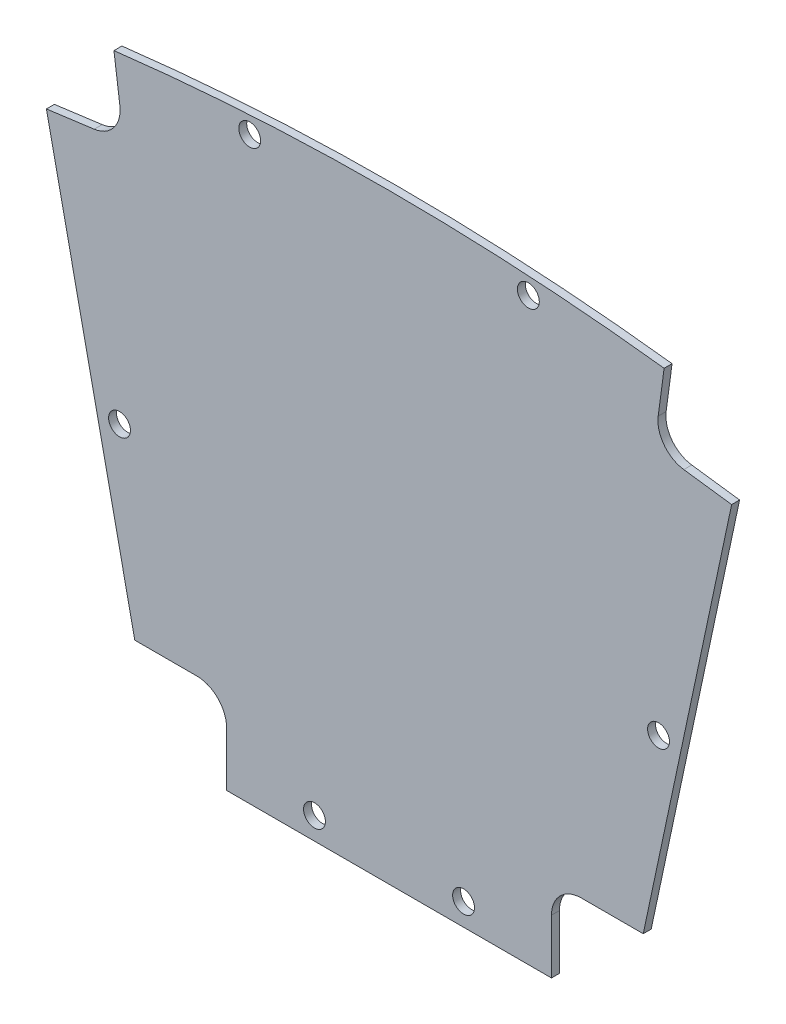
ISO-10303-21;
HEADER;
FILE_DESCRIPTION(('STEP AP214'),'2;1');
FILE_NAME('part.step','',(''),(''),'','','');
FILE_SCHEMA(('AUTOMOTIVE_DESIGN { 1 0 10303 214 1 1 1 1 }'));
ENDSEC;
DATA;
#1=APPLICATION_CONTEXT('core data for automotive mechanical design processes');
#2=APPLICATION_PROTOCOL_DEFINITION('international standard','automotive_design',2000,#1);
#3=PRODUCT_CONTEXT('',#1,'mechanical');
#4=PRODUCT('Part','Part','',(#3));
#5=PRODUCT_RELATED_PRODUCT_CATEGORY('part','',(#4));
#6=PRODUCT_DEFINITION_FORMATION('','',#4);
#7=PRODUCT_DEFINITION_CONTEXT('part definition',#1,'design');
#8=PRODUCT_DEFINITION('design','',#6,#7);
#9=PRODUCT_DEFINITION_SHAPE('','',#8);
#10=(LENGTH_UNIT() NAMED_UNIT(*) SI_UNIT(.MILLI.,.METRE.));
#11=(NAMED_UNIT(*) PLANE_ANGLE_UNIT() SI_UNIT($,.RADIAN.));
#12=(NAMED_UNIT(*) SI_UNIT($,.STERADIAN.) SOLID_ANGLE_UNIT());
#13=UNCERTAINTY_MEASURE_WITH_UNIT(LENGTH_MEASURE(1.E-05),#10,'distance_accuracy_value','');
#14=(GEOMETRIC_REPRESENTATION_CONTEXT(3) GLOBAL_UNCERTAINTY_ASSIGNED_CONTEXT((#13)) GLOBAL_UNIT_ASSIGNED_CONTEXT((#10,
#11,#12)) REPRESENTATION_CONTEXT('',''));
#15=CARTESIAN_POINT('',(0.,0.,0.));
#16=DIRECTION('',(0.,0.,1.));
#17=DIRECTION('',(1.,0.,0.));
#18=AXIS2_PLACEMENT_3D('',#15,#16,#17);
#19=CARTESIAN_POINT('',(0.,-402.867496497193,1.6));
#20=DIRECTION('',(0.,0.,1.));
#21=DIRECTION('',(1.,0.,0.));
#22=AXIS2_PLACEMENT_3D('',#19,#20,#21);
#23=PLANE('',#22);
#24=CARTESIAN_POINT('',(54.2394424791723,-6.73042928919355,1.6));
#25=DIRECTION('',(0.,0.,1.));
#26=DIRECTION('',(-1.,0.,0.));
#27=AXIS2_PLACEMENT_3D('',#24,#25,#26);
#28=CIRCLE('',#27,2.20000000000001);
#29=CARTESIAN_POINT('',(52.0394424791723,-6.73042928919355,1.6));
#30=VERTEX_POINT('',#29);
#31=EDGE_CURVE('E328',#30,#30,#28,.T.);
#32=ORIENTED_EDGE('',*,*,#31,.F.);
#33=EDGE_LOOP('',(#32));
#34=FACE_BOUND('',#33,.T.);
#35=CARTESIAN_POINT('',(-15.,-55.2941066679907,1.6));
#36=DIRECTION('',(0.,0.,1.));
#37=DIRECTION('',(1.,0.,0.));
#38=AXIS2_PLACEMENT_3D('',#35,#36,#37);
#39=CIRCLE('',#38,2.2);
#40=CARTESIAN_POINT('',(-12.8,-55.2941066679907,1.6));
#41=VERTEX_POINT('',#40);
#42=EDGE_CURVE('E316',#41,#41,#39,.T.);
#43=ORIENTED_EDGE('',*,*,#42,.F.);
#44=EDGE_LOOP('',(#43));
#45=FACE_BOUND('',#44,.T.);
#46=CARTESIAN_POINT('',(-28.0398435867955,56.8532825264212,1.6));
#47=DIRECTION('',(0.,0.,1.));
#48=DIRECTION('',(1.,0.,0.));
#49=AXIS2_PLACEMENT_3D('',#46,#47,#48);
#50=CIRCLE('',#49,2.2);
#51=CARTESIAN_POINT('',(-25.8398435867955,56.8532825264212,1.6));
#52=VERTEX_POINT('',#51);
#53=EDGE_CURVE('E189',#52,#52,#50,.T.);
#54=ORIENTED_EDGE('',*,*,#53,.F.);
#55=EDGE_LOOP('',(#54));
#56=FACE_BOUND('',#55,.T.);
#57=CARTESIAN_POINT('',(0.,-402.867496497193,1.6));
#58=DIRECTION('',(0.,0.,1.));
#59=DIRECTION('',(1.,0.,0.));
#60=AXIS2_PLACEMENT_3D('',#57,#58,#59);
#61=CIRCLE('',#60,464.);
#62=CARTESIAN_POINT('',(55.3628314309677,57.817815723575,1.6));
#63=VERTEX_POINT('',#62);
#64=CARTESIAN_POINT('',(-55.3628314309677,57.817815723575,1.6));
#65=VERTEX_POINT('',#64);
#66=EDGE_CURVE('E54',#63,#65,#61,.T.);
#67=ORIENTED_EDGE('',*,*,#66,.T.);
#68=DIRECTION('',(0.131884040495391,-0.991265151138993,0.));
#69=VECTOR('',#68,1.);
#70=CARTESIAN_POINT('',(-55.3628314309677,57.817815723575,1.6));
#71=LINE('',#70,#69);
#72=CARTESIAN_POINT('',(-54.1728843073821,48.8739502575355,1.6));
#73=VERTEX_POINT('',#72);
#74=EDGE_CURVE('E122',#65,#73,#71,.T.);
#75=ORIENTED_EDGE('',*,*,#74,.T.);
#76=CARTESIAN_POINT('',(-60.1204752142167,48.0826460145631,1.6));
#77=DIRECTION('',(0.,0.,-1.));
#78=DIRECTION('',(-1.,0.,0.));
#79=AXIS2_PLACEMENT_3D('',#76,#77,#78);
#80=CIRCLE('',#79,6.00000000000062);
#81=CARTESIAN_POINT('',(-59.3291709712428,42.1350551077287,1.6));
#82=VERTEX_POINT('',#81);
#83=EDGE_CURVE('E257',#73,#82,#80,.T.);
#84=ORIENTED_EDGE('',*,*,#83,.T.);
#85=DIRECTION('',(-0.991265151138961,-0.131884040495627,0.));
#86=VECTOR('',#85,1.);
#87=CARTESIAN_POINT('',(-59.3291709712428,42.1350551077287,1.6));
#88=LINE('',#87,#86);
#89=CARTESIAN_POINT('',(-68.9544530821245,40.8544481034022,1.6));
#90=VERTEX_POINT('',#89);
#91=EDGE_CURVE('E276',#82,#90,#88,.T.);
#92=ORIENTED_EDGE('',*,*,#91,.T.);
#93=DIRECTION('',(0.207911690817756,-0.978147600733806,0.));
#94=VECTOR('',#93,1.);
#95=CARTESIAN_POINT('',(-67.0274539414674,31.7886299253279,1.6));
#96=LINE('',#95,#94);
#97=CARTESIAN_POINT('',(-51.1634681219613,-42.845555417461,1.6));
#98=VERTEX_POINT('',#97);
#99=EDGE_CURVE('E273',#90,#98,#96,.T.);
#100=ORIENTED_EDGE('',*,*,#99,.T.);
#101=DIRECTION('',(1.,0.,0.));
#102=VECTOR('',#101,1.);
#103=CARTESIAN_POINT('',(-38.6949803535644,-42.845555417461,1.6));
#104=LINE('',#103,#102);
#105=CARTESIAN_POINT('',(-38.6949803535644,-42.845555417461,1.6));
#106=VERTEX_POINT('',#105);
#107=EDGE_CURVE('E275',#98,#106,#104,.T.);
#108=ORIENTED_EDGE('',*,*,#107,.T.);
#109=CARTESIAN_POINT('',(-38.6949803535644,-48.845555417461,1.6));
#110=DIRECTION('',(0.,0.,-1.));
#111=DIRECTION('',(1.,0.,0.));
#112=AXIS2_PLACEMENT_3D('',#109,#110,#111);
#113=CIRCLE('',#112,6.);
#114=CARTESIAN_POINT('',(-32.6949803535644,-48.845555417461,1.6));
#115=VERTEX_POINT('',#114);
#116=EDGE_CURVE('E278',#106,#115,#113,.T.);
#117=ORIENTED_EDGE('',*,*,#116,.T.);
#118=DIRECTION('',(0.,-1.,0.));
#119=VECTOR('',#118,1.);
#120=CARTESIAN_POINT('',(-32.6949803535644,-59.7941066679907,1.6));
#121=LINE('',#120,#119);
#122=CARTESIAN_POINT('',(-32.6949803535644,-59.7941066679907,1.6));
#123=VERTEX_POINT('',#122);
#124=EDGE_CURVE('E284',#115,#123,#121,.T.);
#125=ORIENTED_EDGE('',*,*,#124,.T.);
#126=DIRECTION('',(1.,0.,0.));
#127=VECTOR('',#126,1.);
#128=CARTESIAN_POINT('',(-20.,-59.7941066679907,1.6));
#129=LINE('',#128,#127);
#130=CARTESIAN_POINT('',(32.6949803535644,-59.7941066679907,1.6));
#131=VERTEX_POINT('',#130);
#132=EDGE_CURVE('E286',#123,#131,#129,.T.);
#133=ORIENTED_EDGE('',*,*,#132,.T.);
#134=DIRECTION('',(0.,1.,0.));
#135=VECTOR('',#134,1.);
#136=CARTESIAN_POINT('',(32.6949803535644,-59.7941066679907,1.6));
#137=LINE('',#136,#135);
#138=CARTESIAN_POINT('',(32.6949803535644,-48.845555417461,1.6));
#139=VERTEX_POINT('',#138);
#140=EDGE_CURVE('E288',#131,#139,#137,.T.);
#141=ORIENTED_EDGE('',*,*,#140,.T.);
#142=CARTESIAN_POINT('',(38.6949803535644,-48.845555417461,1.6));
#143=DIRECTION('',(0.,0.,-1.));
#144=DIRECTION('',(-1.,0.,0.));
#145=AXIS2_PLACEMENT_3D('',#142,#143,#144);
#146=CIRCLE('',#145,5.99999999999999);
#147=CARTESIAN_POINT('',(38.6949803535644,-42.845555417461,1.6));
#148=VERTEX_POINT('',#147);
#149=EDGE_CURVE('E290',#139,#148,#146,.T.);
#150=ORIENTED_EDGE('',*,*,#149,.T.);
#151=DIRECTION('',(1.,0.,0.));
#152=VECTOR('',#151,1.);
#153=CARTESIAN_POINT('',(38.6949803535644,-42.845555417461,1.6));
#154=LINE('',#153,#152);
#155=CARTESIAN_POINT('',(51.1634681219613,-42.845555417461,1.6));
#156=VERTEX_POINT('',#155);
#157=EDGE_CURVE('E292',#148,#156,#154,.T.);
#158=ORIENTED_EDGE('',*,*,#157,.T.);
#159=DIRECTION('',(0.207911690817756,0.978147600733806,0.));
#160=VECTOR('',#159,1.);
#161=CARTESIAN_POINT('',(51.1634681219613,-42.845555417461,1.6));
#162=LINE('',#161,#160);
#163=CARTESIAN_POINT('',(68.9544530821245,40.8544481034021,1.6));
#164=VERTEX_POINT('',#163);
#165=EDGE_CURVE('E166',#156,#164,#162,.T.);
#166=ORIENTED_EDGE('',*,*,#165,.T.);
#167=DIRECTION('',(-0.991265151138961,0.131884040495627,0.));
#168=VECTOR('',#167,1.);
#169=CARTESIAN_POINT('',(59.3291709712428,42.1350551077287,1.6));
#170=LINE('',#169,#168);
#171=CARTESIAN_POINT('',(59.3291709712428,42.1350551077287,1.6));
#172=VERTEX_POINT('',#171);
#173=EDGE_CURVE('E160',#164,#172,#170,.T.);
#174=ORIENTED_EDGE('',*,*,#173,.T.);
#175=CARTESIAN_POINT('',(60.1204752142167,48.082646014563,1.6));
#176=DIRECTION('',(0.,0.,-1.));
#177=DIRECTION('',(1.,0.,0.));
#178=AXIS2_PLACEMENT_3D('',#175,#176,#177);
#179=CIRCLE('',#178,6.00000000000062);
#180=CARTESIAN_POINT('',(54.1728843073821,48.8739502575355,1.6));
#181=VERTEX_POINT('',#180);
#182=EDGE_CURVE('E164',#172,#181,#179,.T.);
#183=ORIENTED_EDGE('',*,*,#182,.T.);
#184=DIRECTION('',(0.131884040495392,0.991265151138993,0.));
#185=VECTOR('',#184,1.);
#186=CARTESIAN_POINT('',(55.3628314309677,57.817815723575,1.6));
#187=LINE('',#186,#185);
#188=EDGE_CURVE('E180',#181,#63,#187,.T.);
#189=ORIENTED_EDGE('',*,*,#188,.T.);
#190=EDGE_LOOP('',(#67,#75,#84,#92,#100,#108,#117,#125,#133,#141,#150,#158,#166,#174,#183,#189));
#191=FACE_BOUND('',#190,.T.);
#192=CARTESIAN_POINT('',(-54.2394424791723,-6.73042928919355,1.6));
#193=DIRECTION('',(0.,0.,1.));
#194=DIRECTION('',(1.,0.,0.));
#195=AXIS2_PLACEMENT_3D('',#192,#193,#194);
#196=CIRCLE('',#195,2.20000000000001);
#197=CARTESIAN_POINT('',(-52.0394424791723,-6.73042928919355,1.6));
#198=VERTEX_POINT('',#197);
#199=EDGE_CURVE('E310',#198,#198,#196,.T.);
#200=ORIENTED_EDGE('',*,*,#199,.F.);
#201=EDGE_LOOP('',(#200));
#202=FACE_BOUND('',#201,.T.);
#203=CARTESIAN_POINT('',(15.,-55.2941066679907,1.6));
#204=DIRECTION('',(0.,0.,1.));
#205=DIRECTION('',(-1.,0.,0.));
#206=AXIS2_PLACEMENT_3D('',#203,#204,#205);
#207=CIRCLE('',#206,2.2);
#208=CARTESIAN_POINT('',(12.8,-55.2941066679907,1.6));
#209=VERTEX_POINT('',#208);
#210=EDGE_CURVE('E322',#209,#209,#207,.T.);
#211=ORIENTED_EDGE('',*,*,#210,.F.);
#212=EDGE_LOOP('',(#211));
#213=FACE_BOUND('',#212,.T.);
#214=CARTESIAN_POINT('',(28.0398435867955,56.8532825264212,1.6));
#215=DIRECTION('',(0.,0.,1.));
#216=DIRECTION('',(-1.,0.,0.));
#217=AXIS2_PLACEMENT_3D('',#214,#215,#216);
#218=CIRCLE('',#217,2.2);
#219=CARTESIAN_POINT('',(25.8398435867955,56.8532825264212,1.6));
#220=VERTEX_POINT('',#219);
#221=EDGE_CURVE('E334',#220,#220,#218,.T.);
#222=ORIENTED_EDGE('',*,*,#221,.F.);
#223=EDGE_LOOP('',(#222));
#224=FACE_BOUND('',#223,.T.);
#225=ADVANCED_FACE('F37',(#34,#45,#56,#191,#202,#213,#224),#23,.T.);
#226=CARTESIAN_POINT('',(0.,-402.867496497193,0.));
#227=DIRECTION('',(0.,0.,1.));
#228=DIRECTION('',(1.,0.,0.));
#229=AXIS2_PLACEMENT_3D('',#226,#227,#228);
#230=PLANE('',#229);
#231=DIRECTION('',(0.131884040495391,-0.991265151138993,0.));
#232=VECTOR('',#231,1.);
#233=CARTESIAN_POINT('',(-55.3628314309677,57.817815723575,0.));
#234=LINE('',#233,#232);
#235=CARTESIAN_POINT('',(-55.3628314309677,57.817815723575,0.));
#236=VERTEX_POINT('',#235);
#237=CARTESIAN_POINT('',(-54.1728843073821,48.8739502575355,0.));
#238=VERTEX_POINT('',#237);
#239=EDGE_CURVE('E186',#236,#238,#234,.T.);
#240=ORIENTED_EDGE('',*,*,#239,.F.);
#241=CARTESIAN_POINT('',(0.,-402.867496497193,0.));
#242=DIRECTION('',(0.,0.,1.));
#243=DIRECTION('',(-1.,0.,0.));
#244=AXIS2_PLACEMENT_3D('',#241,#242,#243);
#245=CIRCLE('',#244,464.);
#246=CARTESIAN_POINT('',(55.3628314309677,57.817815723575,0.));
#247=VERTEX_POINT('',#246);
#248=EDGE_CURVE('E217',#247,#236,#245,.T.);
#249=ORIENTED_EDGE('',*,*,#248,.F.);
#250=DIRECTION('',(0.131884040495392,0.991265151138993,0.));
#251=VECTOR('',#250,1.);
#252=CARTESIAN_POINT('',(55.3628314309677,57.817815723575,0.));
#253=LINE('',#252,#251);
#254=CARTESIAN_POINT('',(54.1728843073821,48.8739502575355,0.));
#255=VERTEX_POINT('',#254);
#256=EDGE_CURVE('E115',#255,#247,#253,.T.);
#257=ORIENTED_EDGE('',*,*,#256,.F.);
#258=CARTESIAN_POINT('',(60.1204752142167,48.082646014563,0.));
#259=DIRECTION('',(0.,0.,-1.));
#260=DIRECTION('',(1.,0.,0.));
#261=AXIS2_PLACEMENT_3D('',#258,#259,#260);
#262=CIRCLE('',#261,6.00000000000062);
#263=CARTESIAN_POINT('',(59.3291709712428,42.1350551077287,0.));
#264=VERTEX_POINT('',#263);
#265=EDGE_CURVE('E108',#264,#255,#262,.T.);
#266=ORIENTED_EDGE('',*,*,#265,.F.);
#267=DIRECTION('',(-0.991265151138961,0.131884040495627,0.));
#268=VECTOR('',#267,1.);
#269=CARTESIAN_POINT('',(59.3291709712428,42.1350551077287,0.));
#270=LINE('',#269,#268);
#271=CARTESIAN_POINT('',(68.9544530821245,40.8544481034021,0.));
#272=VERTEX_POINT('',#271);
#273=EDGE_CURVE('E174',#272,#264,#270,.T.);
#274=ORIENTED_EDGE('',*,*,#273,.F.);
#275=DIRECTION('',(0.207911690817756,0.978147600733806,0.));
#276=VECTOR('',#275,1.);
#277=CARTESIAN_POINT('',(67.0274539414674,31.7886299253279,0.));
#278=LINE('',#277,#276);
#279=CARTESIAN_POINT('',(51.1634681219613,-42.845555417461,0.));
#280=VERTEX_POINT('',#279);
#281=EDGE_CURVE('E212',#280,#272,#278,.T.);
#282=ORIENTED_EDGE('',*,*,#281,.F.);
#283=DIRECTION('',(1.,0.,0.));
#284=VECTOR('',#283,1.);
#285=CARTESIAN_POINT('',(38.6949803535644,-42.845555417461,0.));
#286=LINE('',#285,#284);
#287=CARTESIAN_POINT('',(38.6949803535644,-42.845555417461,0.));
#288=VERTEX_POINT('',#287);
#289=EDGE_CURVE('E209',#288,#280,#286,.T.);
#290=ORIENTED_EDGE('',*,*,#289,.F.);
#291=CARTESIAN_POINT('',(38.6949803535644,-48.845555417461,0.));
#292=DIRECTION('',(0.,0.,-1.));
#293=DIRECTION('',(-1.,0.,0.));
#294=AXIS2_PLACEMENT_3D('',#291,#292,#293);
#295=CIRCLE('',#294,5.99999999999999);
#296=CARTESIAN_POINT('',(32.6949803535644,-48.845555417461,0.));
#297=VERTEX_POINT('',#296);
#298=EDGE_CURVE('E207',#297,#288,#295,.T.);
#299=ORIENTED_EDGE('',*,*,#298,.F.);
#300=DIRECTION('',(0.,1.,0.));
#301=VECTOR('',#300,1.);
#302=CARTESIAN_POINT('',(32.6949803535644,-59.7941066679907,0.));
#303=LINE('',#302,#301);
#304=CARTESIAN_POINT('',(32.6949803535644,-59.7941066679907,0.));
#305=VERTEX_POINT('',#304);
#306=EDGE_CURVE('E205',#305,#297,#303,.T.);
#307=ORIENTED_EDGE('',*,*,#306,.F.);
#308=DIRECTION('',(1.,0.,0.));
#309=VECTOR('',#308,1.);
#310=CARTESIAN_POINT('',(20.,-59.7941066679907,0.));
#311=LINE('',#310,#309);
#312=CARTESIAN_POINT('',(-32.6949803535644,-59.7941066679907,0.));
#313=VERTEX_POINT('',#312);
#314=EDGE_CURVE('E203',#313,#305,#311,.T.);
#315=ORIENTED_EDGE('',*,*,#314,.F.);
#316=DIRECTION('',(0.,-1.,0.));
#317=VECTOR('',#316,1.);
#318=CARTESIAN_POINT('',(-32.6949803535644,-59.7941066679907,0.));
#319=LINE('',#318,#317);
#320=CARTESIAN_POINT('',(-32.6949803535644,-48.845555417461,0.));
#321=VERTEX_POINT('',#320);
#322=EDGE_CURVE('E200',#321,#313,#319,.T.);
#323=ORIENTED_EDGE('',*,*,#322,.F.);
#324=CARTESIAN_POINT('',(-38.6949803535644,-48.845555417461,0.));
#325=DIRECTION('',(0.,0.,-1.));
#326=DIRECTION('',(1.,0.,0.));
#327=AXIS2_PLACEMENT_3D('',#324,#325,#326);
#328=CIRCLE('',#327,6.);
#329=CARTESIAN_POINT('',(-38.6949803535644,-42.845555417461,0.));
#330=VERTEX_POINT('',#329);
#331=EDGE_CURVE('E198',#330,#321,#328,.T.);
#332=ORIENTED_EDGE('',*,*,#331,.F.);
#333=DIRECTION('',(1.,0.,0.));
#334=VECTOR('',#333,1.);
#335=CARTESIAN_POINT('',(-38.6949803535644,-42.845555417461,0.));
#336=LINE('',#335,#334);
#337=CARTESIAN_POINT('',(-51.1634681219613,-42.845555417461,0.));
#338=VERTEX_POINT('',#337);
#339=EDGE_CURVE('E196',#338,#330,#336,.T.);
#340=ORIENTED_EDGE('',*,*,#339,.F.);
#341=DIRECTION('',(0.207911690817756,-0.978147600733806,0.));
#342=VECTOR('',#341,1.);
#343=CARTESIAN_POINT('',(-51.1634681219613,-42.845555417461,0.));
#344=LINE('',#343,#342);
#345=CARTESIAN_POINT('',(-68.9544530821245,40.8544481034022,0.));
#346=VERTEX_POINT('',#345);
#347=EDGE_CURVE('E194',#346,#338,#344,.T.);
#348=ORIENTED_EDGE('',*,*,#347,.F.);
#349=DIRECTION('',(-0.991265151138961,-0.131884040495627,0.));
#350=VECTOR('',#349,1.);
#351=CARTESIAN_POINT('',(-59.3291709712428,42.1350551077287,0.));
#352=LINE('',#351,#350);
#353=CARTESIAN_POINT('',(-59.3291709712428,42.1350551077287,0.));
#354=VERTEX_POINT('',#353);
#355=EDGE_CURVE('E191',#354,#346,#352,.T.);
#356=ORIENTED_EDGE('',*,*,#355,.F.);
#357=CARTESIAN_POINT('',(-60.1204752142167,48.0826460145631,0.));
#358=DIRECTION('',(0.,0.,-1.));
#359=DIRECTION('',(-1.,0.,0.));
#360=AXIS2_PLACEMENT_3D('',#357,#358,#359);
#361=CIRCLE('',#360,6.00000000000062);
#362=EDGE_CURVE('E188',#238,#354,#361,.T.);
#363=ORIENTED_EDGE('',*,*,#362,.F.);
#364=EDGE_LOOP('',(#240,#249,#257,#266,#274,#282,#290,#299,#307,#315,#323,#332,#340,#348,#356,#363));
#365=FACE_BOUND('',#364,.T.);
#366=CARTESIAN_POINT('',(-28.0398435867955,56.8532825264212,0.));
#367=DIRECTION('',(0.,0.,1.));
#368=DIRECTION('',(1.,0.,0.));
#369=AXIS2_PLACEMENT_3D('',#366,#367,#368);
#370=CIRCLE('',#369,2.2);
#371=CARTESIAN_POINT('',(-25.8398435867955,56.8532825264212,0.));
#372=VERTEX_POINT('',#371);
#373=EDGE_CURVE('E307',#372,#372,#370,.T.);
#374=ORIENTED_EDGE('',*,*,#373,.T.);
#375=EDGE_LOOP('',(#374));
#376=FACE_BOUND('',#375,.T.);
#377=CARTESIAN_POINT('',(-54.2394424791723,-6.73042928919355,0.));
#378=DIRECTION('',(0.,0.,1.));
#379=DIRECTION('',(1.,0.,0.));
#380=AXIS2_PLACEMENT_3D('',#377,#378,#379);
#381=CIRCLE('',#380,2.20000000000001);
#382=CARTESIAN_POINT('',(-52.0394424791723,-6.73042928919355,0.));
#383=VERTEX_POINT('',#382);
#384=EDGE_CURVE('E313',#383,#383,#381,.T.);
#385=ORIENTED_EDGE('',*,*,#384,.T.);
#386=EDGE_LOOP('',(#385));
#387=FACE_BOUND('',#386,.T.);
#388=CARTESIAN_POINT('',(-15.,-55.2941066679907,0.));
#389=DIRECTION('',(0.,0.,1.));
#390=DIRECTION('',(1.,0.,0.));
#391=AXIS2_PLACEMENT_3D('',#388,#389,#390);
#392=CIRCLE('',#391,2.2);
#393=CARTESIAN_POINT('',(-12.8,-55.2941066679907,0.));
#394=VERTEX_POINT('',#393);
#395=EDGE_CURVE('E319',#394,#394,#392,.T.);
#396=ORIENTED_EDGE('',*,*,#395,.T.);
#397=EDGE_LOOP('',(#396));
#398=FACE_BOUND('',#397,.T.);
#399=CARTESIAN_POINT('',(15.,-55.2941066679907,0.));
#400=DIRECTION('',(0.,0.,1.));
#401=DIRECTION('',(-1.,0.,0.));
#402=AXIS2_PLACEMENT_3D('',#399,#400,#401);
#403=CIRCLE('',#402,2.2);
#404=CARTESIAN_POINT('',(12.8,-55.2941066679907,0.));
#405=VERTEX_POINT('',#404);
#406=EDGE_CURVE('E325',#405,#405,#403,.T.);
#407=ORIENTED_EDGE('',*,*,#406,.T.);
#408=EDGE_LOOP('',(#407));
#409=FACE_BOUND('',#408,.T.);
#410=CARTESIAN_POINT('',(54.2394424791723,-6.73042928919355,0.));
#411=DIRECTION('',(0.,0.,1.));
#412=DIRECTION('',(-1.,0.,0.));
#413=AXIS2_PLACEMENT_3D('',#410,#411,#412);
#414=CIRCLE('',#413,2.20000000000001);
#415=CARTESIAN_POINT('',(52.0394424791723,-6.73042928919355,0.));
#416=VERTEX_POINT('',#415);
#417=EDGE_CURVE('E331',#416,#416,#414,.T.);
#418=ORIENTED_EDGE('',*,*,#417,.T.);
#419=EDGE_LOOP('',(#418));
#420=FACE_BOUND('',#419,.T.);
#421=CARTESIAN_POINT('',(28.0398435867955,56.8532825264212,0.));
#422=DIRECTION('',(0.,0.,1.));
#423=DIRECTION('',(-1.,0.,0.));
#424=AXIS2_PLACEMENT_3D('',#421,#422,#423);
#425=CIRCLE('',#424,2.2);
#426=CARTESIAN_POINT('',(25.8398435867955,56.8532825264212,0.));
#427=VERTEX_POINT('',#426);
#428=EDGE_CURVE('E337',#427,#427,#425,.T.);
#429=ORIENTED_EDGE('',*,*,#428,.T.);
#430=EDGE_LOOP('',(#429));
#431=FACE_BOUND('',#430,.T.);
#432=ADVANCED_FACE('F261',(#365,#376,#387,#398,#409,#420,#431),#230,.F.);
#433=CARTESIAN_POINT('',(-55.3628314309677,57.817815723575,1.6));
#434=DIRECTION('',(0.991265151138993,0.131884040495391,0.));
#435=DIRECTION('',(-0.131884040495391,0.991265151138993,0.));
#436=AXIS2_PLACEMENT_3D('',#433,#434,#435);
#437=PLANE('',#436);
#438=ORIENTED_EDGE('',*,*,#239,.T.);
#439=DIRECTION('',(0.,0.,-1.));
#440=VECTOR('',#439,1.);
#441=CARTESIAN_POINT('',(-54.1728843073821,48.8739502575355,1.6));
#442=LINE('',#441,#440);
#443=EDGE_CURVE('E46',#73,#238,#442,.T.);
#444=ORIENTED_EDGE('',*,*,#443,.F.);
#445=ORIENTED_EDGE('',*,*,#74,.F.);
#446=DIRECTION('',(0.,0.,-1.));
#447=VECTOR('',#446,1.);
#448=CARTESIAN_POINT('',(-55.3628314309677,57.817815723575,1.6));
#449=LINE('',#448,#447);
#450=EDGE_CURVE('E11',#65,#236,#449,.T.);
#451=ORIENTED_EDGE('',*,*,#450,.T.);
#452=EDGE_LOOP('',(#438,#444,#445,#451));
#453=FACE_BOUND('',#452,.T.);
#454=ADVANCED_FACE('F39',(#453),#437,.F.);
#455=CARTESIAN_POINT('',(-60.1204752142167,48.0826460145631,1.6));
#456=DIRECTION('',(0.,0.,-1.));
#457=DIRECTION('',(-1.,0.,0.));
#458=AXIS2_PLACEMENT_3D('',#455,#456,#457);
#459=CYLINDRICAL_SURFACE('',#458,6.00000000000062);
#460=ORIENTED_EDGE('',*,*,#362,.T.);
#461=DIRECTION('',(0.,0.,-1.));
#462=VECTOR('',#461,1.);
#463=CARTESIAN_POINT('',(-59.3291709712428,42.1350551077287,1.6));
#464=LINE('',#463,#462);
#465=EDGE_CURVE('E249',#82,#354,#464,.T.);
#466=ORIENTED_EDGE('',*,*,#465,.F.);
#467=ORIENTED_EDGE('',*,*,#83,.F.);
#468=ORIENTED_EDGE('',*,*,#443,.T.);
#469=EDGE_LOOP('',(#460,#466,#467,#468));
#470=FACE_BOUND('',#469,.T.);
#471=ADVANCED_FACE('F255',(#470),#459,.F.);
#472=CARTESIAN_POINT('',(-59.3291709712428,42.1350551077287,1.6));
#473=DIRECTION('',(0.131884040495627,-0.991265151138961,0.));
#474=DIRECTION('',(0.991265151138961,0.131884040495627,0.));
#475=AXIS2_PLACEMENT_3D('',#472,#473,#474);
#476=PLANE('',#475);
#477=ORIENTED_EDGE('',*,*,#355,.T.);
#478=DIRECTION('',(0.,0.,-1.));
#479=VECTOR('',#478,1.);
#480=CARTESIAN_POINT('',(-68.9544530821245,40.8544481034022,1.6));
#481=LINE('',#480,#479);
#482=EDGE_CURVE('E246',#90,#346,#481,.T.);
#483=ORIENTED_EDGE('',*,*,#482,.F.);
#484=ORIENTED_EDGE('',*,*,#91,.F.);
#485=ORIENTED_EDGE('',*,*,#465,.T.);
#486=EDGE_LOOP('',(#477,#483,#484,#485));
#487=FACE_BOUND('',#486,.T.);
#488=ADVANCED_FACE('F267',(#487),#476,.F.);
#489=CARTESIAN_POINT('',(-51.1634681219613,-42.845555417461,1.6));
#490=DIRECTION('',(0.978147600733806,0.207911690817756,0.));
#491=DIRECTION('',(-0.207911690817756,0.978147600733806,0.));
#492=AXIS2_PLACEMENT_3D('',#489,#490,#491);
#493=PLANE('',#492);
#494=ORIENTED_EDGE('',*,*,#347,.T.);
#495=DIRECTION('',(0.,0.,-1.));
#496=VECTOR('',#495,1.);
#497=CARTESIAN_POINT('',(-51.1634681219613,-42.845555417461,1.6));
#498=LINE('',#497,#496);
#499=EDGE_CURVE('E243',#98,#338,#498,.T.);
#500=ORIENTED_EDGE('',*,*,#499,.F.);
#501=ORIENTED_EDGE('',*,*,#99,.F.);
#502=ORIENTED_EDGE('',*,*,#482,.T.);
#503=EDGE_LOOP('',(#494,#500,#501,#502));
#504=FACE_BOUND('',#503,.T.);
#505=ADVANCED_FACE('F271',(#504),#493,.F.);
#506=CARTESIAN_POINT('',(-38.6949803535644,-42.845555417461,1.6));
#507=DIRECTION('',(0.,1.,0.));
#508=DIRECTION('',(0.,0.,1.));
#509=AXIS2_PLACEMENT_3D('',#506,#507,#508);
#510=PLANE('',#509);
#511=ORIENTED_EDGE('',*,*,#339,.T.);
#512=DIRECTION('',(0.,0.,-1.));
#513=VECTOR('',#512,1.);
#514=CARTESIAN_POINT('',(-38.6949803535644,-42.845555417461,1.6));
#515=LINE('',#514,#513);
#516=EDGE_CURVE('E240',#106,#330,#515,.T.);
#517=ORIENTED_EDGE('',*,*,#516,.F.);
#518=ORIENTED_EDGE('',*,*,#107,.F.);
#519=ORIENTED_EDGE('',*,*,#499,.T.);
#520=EDGE_LOOP('',(#511,#517,#518,#519));
#521=FACE_BOUND('',#520,.T.);
#522=ADVANCED_FACE('F390',(#521),#510,.F.);
#523=CARTESIAN_POINT('',(-38.6949803535644,-48.845555417461,1.6));
#524=DIRECTION('',(0.,0.,-1.));
#525=DIRECTION('',(-1.,0.,0.));
#526=AXIS2_PLACEMENT_3D('',#523,#524,#525);
#527=CYLINDRICAL_SURFACE('',#526,6.);
#528=ORIENTED_EDGE('',*,*,#331,.T.);
#529=DIRECTION('',(0.,0.,-1.));
#530=VECTOR('',#529,1.);
#531=CARTESIAN_POINT('',(-32.6949803535644,-48.845555417461,1.6));
#532=LINE('',#531,#530);
#533=EDGE_CURVE('E237',#115,#321,#532,.T.);
#534=ORIENTED_EDGE('',*,*,#533,.F.);
#535=ORIENTED_EDGE('',*,*,#116,.F.);
#536=ORIENTED_EDGE('',*,*,#516,.T.);
#537=EDGE_LOOP('',(#528,#534,#535,#536));
#538=FACE_BOUND('',#537,.T.);
#539=ADVANCED_FACE('F386',(#538),#527,.F.);
#540=CARTESIAN_POINT('',(-32.6949803535644,-59.7941066679907,1.6));
#541=DIRECTION('',(1.,0.,0.));
#542=DIRECTION('',(0.,0.,-1.));
#543=AXIS2_PLACEMENT_3D('',#540,#541,#542);
#544=PLANE('',#543);
#545=ORIENTED_EDGE('',*,*,#322,.T.);
#546=DIRECTION('',(0.,0.,-1.));
#547=VECTOR('',#546,1.);
#548=CARTESIAN_POINT('',(-32.6949803535644,-59.7941066679907,1.6));
#549=LINE('',#548,#547);
#550=EDGE_CURVE('E234',#123,#313,#549,.T.);
#551=ORIENTED_EDGE('',*,*,#550,.F.);
#552=ORIENTED_EDGE('',*,*,#124,.F.);
#553=ORIENTED_EDGE('',*,*,#533,.T.);
#554=EDGE_LOOP('',(#545,#551,#552,#553));
#555=FACE_BOUND('',#554,.T.);
#556=ADVANCED_FACE('F382',(#555),#544,.F.);
#557=CARTESIAN_POINT('',(20.,-59.7941066679907,1.6));
#558=DIRECTION('',(0.,1.,0.));
#559=DIRECTION('',(0.,0.,1.));
#560=AXIS2_PLACEMENT_3D('',#557,#558,#559);
#561=PLANE('',#560);
#562=ORIENTED_EDGE('',*,*,#314,.T.);
#563=DIRECTION('',(0.,0.,-1.));
#564=VECTOR('',#563,1.);
#565=CARTESIAN_POINT('',(32.6949803535644,-59.7941066679907,1.6));
#566=LINE('',#565,#564);
#567=EDGE_CURVE('E231',#131,#305,#566,.T.);
#568=ORIENTED_EDGE('',*,*,#567,.F.);
#569=ORIENTED_EDGE('',*,*,#132,.F.);
#570=ORIENTED_EDGE('',*,*,#550,.T.);
#571=EDGE_LOOP('',(#562,#568,#569,#570));
#572=FACE_BOUND('',#571,.T.);
#573=ADVANCED_FACE('F378',(#572),#561,.F.);
#574=CARTESIAN_POINT('',(32.6949803535644,-59.7941066679907,1.6));
#575=DIRECTION('',(-1.,0.,0.));
#576=DIRECTION('',(0.,0.,1.));
#577=AXIS2_PLACEMENT_3D('',#574,#575,#576);
#578=PLANE('',#577);
#579=ORIENTED_EDGE('',*,*,#306,.T.);
#580=DIRECTION('',(0.,0.,-1.));
#581=VECTOR('',#580,1.);
#582=CARTESIAN_POINT('',(32.6949803535644,-48.845555417461,1.6));
#583=LINE('',#582,#581);
#584=EDGE_CURVE('E228',#139,#297,#583,.T.);
#585=ORIENTED_EDGE('',*,*,#584,.F.);
#586=ORIENTED_EDGE('',*,*,#140,.F.);
#587=ORIENTED_EDGE('',*,*,#567,.T.);
#588=EDGE_LOOP('',(#579,#585,#586,#587));
#589=FACE_BOUND('',#588,.T.);
#590=ADVANCED_FACE('F374',(#589),#578,.F.);
#591=CARTESIAN_POINT('',(38.6949803535644,-48.845555417461,1.6));
#592=DIRECTION('',(0.,0.,-1.));
#593=DIRECTION('',(-1.,0.,0.));
#594=AXIS2_PLACEMENT_3D('',#591,#592,#593);
#595=CYLINDRICAL_SURFACE('',#594,5.99999999999999);
#596=ORIENTED_EDGE('',*,*,#298,.T.);
#597=DIRECTION('',(0.,0.,-1.));
#598=VECTOR('',#597,1.);
#599=CARTESIAN_POINT('',(38.6949803535644,-42.845555417461,1.6));
#600=LINE('',#599,#598);
#601=EDGE_CURVE('E225',#148,#288,#600,.T.);
#602=ORIENTED_EDGE('',*,*,#601,.F.);
#603=ORIENTED_EDGE('',*,*,#149,.F.);
#604=ORIENTED_EDGE('',*,*,#584,.T.);
#605=EDGE_LOOP('',(#596,#602,#603,#604));
#606=FACE_BOUND('',#605,.T.);
#607=ADVANCED_FACE('F371',(#606),#595,.F.);
#608=CARTESIAN_POINT('',(38.6949803535644,-42.845555417461,1.6));
#609=DIRECTION('',(0.,1.,0.));
#610=DIRECTION('',(0.,0.,1.));
#611=AXIS2_PLACEMENT_3D('',#608,#609,#610);
#612=PLANE('',#611);
#613=ORIENTED_EDGE('',*,*,#289,.T.);
#614=DIRECTION('',(0.,0.,-1.));
#615=VECTOR('',#614,1.);
#616=CARTESIAN_POINT('',(51.1634681219613,-42.845555417461,1.6));
#617=LINE('',#616,#615);
#618=EDGE_CURVE('E222',#156,#280,#617,.T.);
#619=ORIENTED_EDGE('',*,*,#618,.F.);
#620=ORIENTED_EDGE('',*,*,#157,.F.);
#621=ORIENTED_EDGE('',*,*,#601,.T.);
#622=EDGE_LOOP('',(#613,#619,#620,#621));
#623=FACE_BOUND('',#622,.T.);
#624=ADVANCED_FACE('F298',(#623),#612,.F.);
#625=CARTESIAN_POINT('',(67.0274539414674,31.7886299253279,1.6));
#626=DIRECTION('',(-0.978147600733806,0.207911690817756,0.));
#627=DIRECTION('',(-0.207911690817756,-0.978147600733806,0.));
#628=AXIS2_PLACEMENT_3D('',#625,#626,#627);
#629=PLANE('',#628);
#630=ORIENTED_EDGE('',*,*,#281,.T.);
#631=DIRECTION('',(0.,0.,-1.));
#632=VECTOR('',#631,1.);
#633=CARTESIAN_POINT('',(68.9544530821245,40.8544481034021,1.6));
#634=LINE('',#633,#632);
#635=EDGE_CURVE('E175',#164,#272,#634,.T.);
#636=ORIENTED_EDGE('',*,*,#635,.F.);
#637=ORIENTED_EDGE('',*,*,#165,.F.);
#638=ORIENTED_EDGE('',*,*,#618,.T.);
#639=EDGE_LOOP('',(#630,#636,#637,#638));
#640=FACE_BOUND('',#639,.T.);
#641=ADVANCED_FACE('F301',(#640),#629,.F.);
#642=CARTESIAN_POINT('',(59.3291709712428,42.1350551077287,1.6));
#643=DIRECTION('',(-0.131884040495627,-0.991265151138961,0.));
#644=DIRECTION('',(0.991265151138961,-0.131884040495627,0.));
#645=AXIS2_PLACEMENT_3D('',#642,#643,#644);
#646=PLANE('',#645);
#647=ORIENTED_EDGE('',*,*,#273,.T.);
#648=DIRECTION('',(0.,0.,-1.));
#649=VECTOR('',#648,1.);
#650=CARTESIAN_POINT('',(59.3291709712428,42.1350551077287,1.6));
#651=LINE('',#650,#649);
#652=EDGE_CURVE('E171',#172,#264,#651,.T.);
#653=ORIENTED_EDGE('',*,*,#652,.F.);
#654=ORIENTED_EDGE('',*,*,#173,.F.);
#655=ORIENTED_EDGE('',*,*,#635,.T.);
#656=EDGE_LOOP('',(#647,#653,#654,#655));
#657=FACE_BOUND('',#656,.T.);
#658=ADVANCED_FACE('F172',(#657),#646,.F.);
#659=CARTESIAN_POINT('',(60.1204752142167,48.082646014563,1.6));
#660=DIRECTION('',(0.,0.,-1.));
#661=DIRECTION('',(-1.,0.,0.));
#662=AXIS2_PLACEMENT_3D('',#659,#660,#661);
#663=CYLINDRICAL_SURFACE('',#662,6.00000000000062);
#664=ORIENTED_EDGE('',*,*,#265,.T.);
#665=DIRECTION('',(0.,0.,-1.));
#666=VECTOR('',#665,1.);
#667=CARTESIAN_POINT('',(54.1728843073821,48.8739502575355,1.6));
#668=LINE('',#667,#666);
#669=EDGE_CURVE('E176',#181,#255,#668,.T.);
#670=ORIENTED_EDGE('',*,*,#669,.F.);
#671=ORIENTED_EDGE('',*,*,#182,.F.);
#672=ORIENTED_EDGE('',*,*,#652,.T.);
#673=EDGE_LOOP('',(#664,#670,#671,#672));
#674=FACE_BOUND('',#673,.T.);
#675=ADVANCED_FACE('F178',(#674),#663,.F.);
#676=CARTESIAN_POINT('',(55.3628314309677,57.817815723575,1.6));
#677=DIRECTION('',(-0.991265151138993,0.131884040495392,0.));
#678=DIRECTION('',(-0.131884040495392,-0.991265151138993,0.));
#679=AXIS2_PLACEMENT_3D('',#676,#677,#678);
#680=PLANE('',#679);
#681=ORIENTED_EDGE('',*,*,#256,.T.);
#682=DIRECTION('',(0.,0.,-1.));
#683=VECTOR('',#682,1.);
#684=CARTESIAN_POINT('',(55.3628314309677,57.817815723575,1.6));
#685=LINE('',#684,#683);
#686=EDGE_CURVE('E182',#63,#247,#685,.T.);
#687=ORIENTED_EDGE('',*,*,#686,.F.);
#688=ORIENTED_EDGE('',*,*,#188,.F.);
#689=ORIENTED_EDGE('',*,*,#669,.T.);
#690=EDGE_LOOP('',(#681,#687,#688,#689));
#691=FACE_BOUND('',#690,.T.);
#692=ADVANCED_FACE('F303',(#691),#680,.F.);
#693=CARTESIAN_POINT('',(0.,-402.867496497193,1.6));
#694=DIRECTION('',(0.,0.,-1.));
#695=DIRECTION('',(-1.,0.,0.));
#696=AXIS2_PLACEMENT_3D('',#693,#694,#695);
#697=CYLINDRICAL_SURFACE('',#696,464.);
#698=ORIENTED_EDGE('',*,*,#248,.T.);
#699=ORIENTED_EDGE('',*,*,#450,.F.);
#700=ORIENTED_EDGE('',*,*,#66,.F.);
#701=ORIENTED_EDGE('',*,*,#686,.T.);
#702=EDGE_LOOP('',(#698,#699,#700,#701));
#703=FACE_BOUND('',#702,.T.);
#704=ADVANCED_FACE('F302',(#703),#697,.T.);
#705=CARTESIAN_POINT('',(-28.0398435867955,56.8532825264212,1.6));
#706=DIRECTION('',(0.,0.,-1.));
#707=DIRECTION('',(-1.,0.,0.));
#708=AXIS2_PLACEMENT_3D('',#705,#706,#707);
#709=CYLINDRICAL_SURFACE('',#708,2.2);
#710=ORIENTED_EDGE('',*,*,#53,.T.);
#711=EDGE_LOOP('',(#710));
#712=FACE_BOUND('',#711,.T.);
#713=ORIENTED_EDGE('',*,*,#373,.F.);
#714=EDGE_LOOP('',(#713));
#715=FACE_BOUND('',#714,.T.);
#716=ADVANCED_FACE('F356',(#712,#715),#709,.F.);
#717=CARTESIAN_POINT('',(-54.2394424791723,-6.73042928919355,1.6));
#718=DIRECTION('',(0.,0.,-1.));
#719=DIRECTION('',(-1.,0.,0.));
#720=AXIS2_PLACEMENT_3D('',#717,#718,#719);
#721=CYLINDRICAL_SURFACE('',#720,2.20000000000001);
#722=ORIENTED_EDGE('',*,*,#199,.T.);
#723=EDGE_LOOP('',(#722));
#724=FACE_BOUND('',#723,.T.);
#725=ORIENTED_EDGE('',*,*,#384,.F.);
#726=EDGE_LOOP('',(#725));
#727=FACE_BOUND('',#726,.T.);
#728=ADVANCED_FACE('F522',(#724,#727),#721,.F.);
#729=CARTESIAN_POINT('',(-15.,-55.2941066679907,1.6));
#730=DIRECTION('',(0.,0.,-1.));
#731=DIRECTION('',(-1.,0.,0.));
#732=AXIS2_PLACEMENT_3D('',#729,#730,#731);
#733=CYLINDRICAL_SURFACE('',#732,2.2);
#734=ORIENTED_EDGE('',*,*,#42,.T.);
#735=EDGE_LOOP('',(#734));
#736=FACE_BOUND('',#735,.T.);
#737=ORIENTED_EDGE('',*,*,#395,.F.);
#738=EDGE_LOOP('',(#737));
#739=FACE_BOUND('',#738,.T.);
#740=ADVANCED_FACE('F530',(#736,#739),#733,.F.);
#741=CARTESIAN_POINT('',(15.,-55.2941066679907,1.6));
#742=DIRECTION('',(0.,0.,-1.));
#743=DIRECTION('',(-1.,0.,0.));
#744=AXIS2_PLACEMENT_3D('',#741,#742,#743);
#745=CYLINDRICAL_SURFACE('',#744,2.2);
#746=ORIENTED_EDGE('',*,*,#210,.T.);
#747=EDGE_LOOP('',(#746));
#748=FACE_BOUND('',#747,.T.);
#749=ORIENTED_EDGE('',*,*,#406,.F.);
#750=EDGE_LOOP('',(#749));
#751=FACE_BOUND('',#750,.T.);
#752=ADVANCED_FACE('F538',(#748,#751),#745,.F.);
#753=CARTESIAN_POINT('',(54.2394424791723,-6.73042928919355,1.6));
#754=DIRECTION('',(0.,0.,-1.));
#755=DIRECTION('',(-1.,0.,0.));
#756=AXIS2_PLACEMENT_3D('',#753,#754,#755);
#757=CYLINDRICAL_SURFACE('',#756,2.20000000000001);
#758=ORIENTED_EDGE('',*,*,#31,.T.);
#759=EDGE_LOOP('',(#758));
#760=FACE_BOUND('',#759,.T.);
#761=ORIENTED_EDGE('',*,*,#417,.F.);
#762=EDGE_LOOP('',(#761));
#763=FACE_BOUND('',#762,.T.);
#764=ADVANCED_FACE('F547',(#760,#763),#757,.F.);
#765=CARTESIAN_POINT('',(28.0398435867955,56.8532825264212,1.6));
#766=DIRECTION('',(0.,0.,-1.));
#767=DIRECTION('',(-1.,0.,0.));
#768=AXIS2_PLACEMENT_3D('',#765,#766,#767);
#769=CYLINDRICAL_SURFACE('',#768,2.2);
#770=ORIENTED_EDGE('',*,*,#221,.T.);
#771=EDGE_LOOP('',(#770));
#772=FACE_BOUND('',#771,.T.);
#773=ORIENTED_EDGE('',*,*,#428,.F.);
#774=EDGE_LOOP('',(#773));
#775=FACE_BOUND('',#774,.T.);
#776=ADVANCED_FACE('F343',(#772,#775),#769,.F.);
#777=CLOSED_SHELL('',(#225,#432,#454,#471,#488,#505,#522,#539,#556,#573,#590,#607,#624,#641,
#658,#675,#692,#704,#716,#728,#740,#752,#764,#776));
#778=MANIFOLD_SOLID_BREP('B2',#777);
#779=ADVANCED_BREP_SHAPE_REPRESENTATION('',(#18,#778),#14);
#780=SHAPE_DEFINITION_REPRESENTATION(#9,#779);
ENDSEC;
END-ISO-10303-21;
